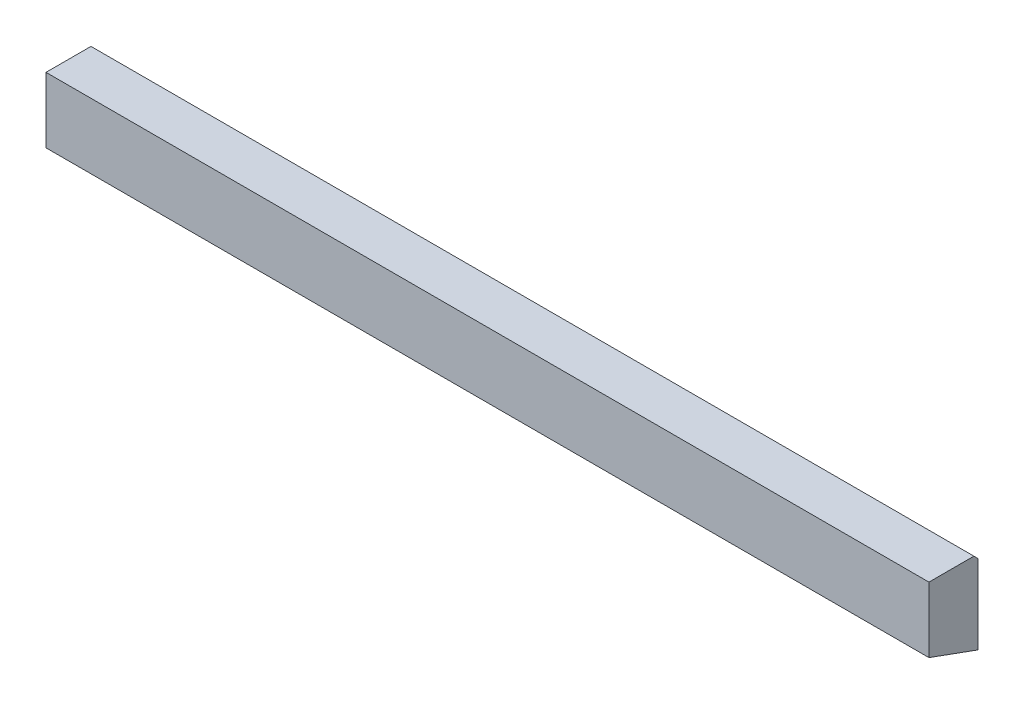
ISO-10303-21;
HEADER;
FILE_DESCRIPTION(('STEP AP214'),'2;1');
FILE_NAME('part.step','',(''),(''),'','','');
FILE_SCHEMA(('AUTOMOTIVE_DESIGN { 1 0 10303 214 1 1 1 1 }'));
ENDSEC;
DATA;
#1=APPLICATION_CONTEXT('core data for automotive mechanical design processes');
#2=APPLICATION_PROTOCOL_DEFINITION('international standard','automotive_design',2000,#1);
#3=PRODUCT_CONTEXT('',#1,'mechanical');
#4=PRODUCT('Part','Part','',(#3));
#5=PRODUCT_RELATED_PRODUCT_CATEGORY('part','',(#4));
#6=PRODUCT_DEFINITION_FORMATION('','',#4);
#7=PRODUCT_DEFINITION_CONTEXT('part definition',#1,'design');
#8=PRODUCT_DEFINITION('design','',#6,#7);
#9=PRODUCT_DEFINITION_SHAPE('','',#8);
#10=(LENGTH_UNIT() NAMED_UNIT(*) SI_UNIT(.MILLI.,.METRE.));
#11=(NAMED_UNIT(*) PLANE_ANGLE_UNIT() SI_UNIT($,.RADIAN.));
#12=(NAMED_UNIT(*) SI_UNIT($,.STERADIAN.) SOLID_ANGLE_UNIT());
#13=UNCERTAINTY_MEASURE_WITH_UNIT(LENGTH_MEASURE(1.E-05),#10,'distance_accuracy_value','');
#14=(GEOMETRIC_REPRESENTATION_CONTEXT(3) GLOBAL_UNCERTAINTY_ASSIGNED_CONTEXT((#13)) GLOBAL_UNIT_ASSIGNED_CONTEXT((#10,
#11,#12)) REPRESENTATION_CONTEXT('',''));
#15=CARTESIAN_POINT('',(0.,0.,0.));
#16=DIRECTION('',(0.,0.,1.));
#17=DIRECTION('',(1.,0.,0.));
#18=AXIS2_PLACEMENT_3D('',#15,#16,#17);
#19=CARTESIAN_POINT('',(108.,0.,0.));
#20=DIRECTION('',(0.,0.93969262078591,-0.342020143325666));
#21=DIRECTION('',(0.,0.342020143325666,0.93969262078591));
#22=AXIS2_PLACEMENT_3D('',#19,#20,#21);
#23=PLANE('',#22);
#24=DIRECTION('',(0.,-0.342020143325666,-0.93969262078591));
#25=VECTOR('',#24,1.);
#26=CARTESIAN_POINT('',(0.,0.,0.));
#27=LINE('',#26,#25);
#28=CARTESIAN_POINT('',(0.,0.,0.));
#29=VERTEX_POINT('',#28);
#30=CARTESIAN_POINT('',(0.,-2.18382140559719,-6.));
#31=VERTEX_POINT('',#30);
#32=EDGE_CURVE('E106',#29,#31,#27,.T.);
#33=ORIENTED_EDGE('',*,*,#32,.T.);
#34=DIRECTION('',(-1.,0.,0.));
#35=VECTOR('',#34,1.);
#36=CARTESIAN_POINT('',(108.,-2.18382140559719,-6.));
#37=LINE('',#36,#35);
#38=CARTESIAN_POINT('',(108.,-2.18382140559719,-6.));
#39=VERTEX_POINT('',#38);
#40=EDGE_CURVE('E87',#39,#31,#37,.T.);
#41=ORIENTED_EDGE('',*,*,#40,.F.);
#42=DIRECTION('',(0.,-0.342020143325666,-0.93969262078591));
#43=VECTOR('',#42,1.);
#44=CARTESIAN_POINT('',(108.,0.,0.));
#45=LINE('',#44,#43);
#46=CARTESIAN_POINT('',(108.,0.,0.));
#47=VERTEX_POINT('',#46);
#48=EDGE_CURVE('E93',#47,#39,#45,.T.);
#49=ORIENTED_EDGE('',*,*,#48,.F.);
#50=DIRECTION('',(-1.,0.,0.));
#51=VECTOR('',#50,1.);
#52=CARTESIAN_POINT('',(108.,0.,0.));
#53=LINE('',#52,#51);
#54=EDGE_CURVE('E116',#47,#29,#53,.T.);
#55=ORIENTED_EDGE('',*,*,#54,.T.);
#56=EDGE_LOOP('',(#33,#41,#49,#55));
#57=FACE_BOUND('',#56,.T.);
#58=ADVANCED_FACE('F39',(#57),#23,.F.);
#59=CARTESIAN_POINT('',(108.,-2.18382140559719,-6.));
#60=DIRECTION('',(0.,0.,1.));
#61=DIRECTION('',(0.,-1.,0.));
#62=AXIS2_PLACEMENT_3D('',#59,#60,#61);
#63=PLANE('',#62);
#64=DIRECTION('',(0.,1.,0.));
#65=VECTOR('',#64,1.);
#66=CARTESIAN_POINT('',(0.,-2.18382140559719,-6.));
#67=LINE('',#66,#65);
#68=CARTESIAN_POINT('',(0.,7.5,-6.));
#69=VERTEX_POINT('',#68);
#70=EDGE_CURVE('E129',#31,#69,#67,.T.);
#71=ORIENTED_EDGE('',*,*,#70,.T.);
#72=DIRECTION('',(1.,0.,0.));
#73=VECTOR('',#72,1.);
#74=CARTESIAN_POINT('',(108.,7.5,-6.));
#75=LINE('',#74,#73);
#76=CARTESIAN_POINT('',(108.,7.5,-6.));
#77=VERTEX_POINT('',#76);
#78=EDGE_CURVE('E48',#69,#77,#75,.T.);
#79=ORIENTED_EDGE('',*,*,#78,.T.);
#80=DIRECTION('',(0.,1.,0.));
#81=VECTOR('',#80,1.);
#82=CARTESIAN_POINT('',(108.,-2.18382140559719,-6.));
#83=LINE('',#82,#81);
#84=EDGE_CURVE('E83',#39,#77,#83,.T.);
#85=ORIENTED_EDGE('',*,*,#84,.F.);
#86=ORIENTED_EDGE('',*,*,#40,.T.);
#87=EDGE_LOOP('',(#71,#79,#85,#86));
#88=FACE_BOUND('',#87,.T.);
#89=ADVANCED_FACE('F85',(#88),#63,.F.);
#90=CARTESIAN_POINT('',(108.,8.,-6.));
#91=DIRECTION('',(0.,-1.,0.));
#92=DIRECTION('',(0.,0.,-1.));
#93=AXIS2_PLACEMENT_3D('',#90,#91,#92);
#94=PLANE('',#93);
#95=DIRECTION('',(0.,0.,1.));
#96=VECTOR('',#95,1.);
#97=CARTESIAN_POINT('',(108.,8.,-6.));
#98=LINE('',#97,#96);
#99=CARTESIAN_POINT('',(108.,8.,-5.50000000000001));
#100=VERTEX_POINT('',#99);
#101=CARTESIAN_POINT('',(108.,8.,0.));
#102=VERTEX_POINT('',#101);
#103=EDGE_CURVE('E92',#100,#102,#98,.T.);
#104=ORIENTED_EDGE('',*,*,#103,.F.);
#105=DIRECTION('',(-1.,0.,0.));
#106=VECTOR('',#105,1.);
#107=CARTESIAN_POINT('',(108.,8.,-5.50000000000001));
#108=LINE('',#107,#106);
#109=CARTESIAN_POINT('',(0.,8.,-5.50000000000001));
#110=VERTEX_POINT('',#109);
#111=EDGE_CURVE('E108',#100,#110,#108,.T.);
#112=ORIENTED_EDGE('',*,*,#111,.T.);
#113=DIRECTION('',(0.,0.,1.));
#114=VECTOR('',#113,1.);
#115=CARTESIAN_POINT('',(0.,8.,-6.));
#116=LINE('',#115,#114);
#117=CARTESIAN_POINT('',(0.,8.,0.));
#118=VERTEX_POINT('',#117);
#119=EDGE_CURVE('E126',#110,#118,#116,.T.);
#120=ORIENTED_EDGE('',*,*,#119,.T.);
#121=DIRECTION('',(-1.,0.,0.));
#122=VECTOR('',#121,1.);
#123=CARTESIAN_POINT('',(108.,8.,0.));
#124=LINE('',#123,#122);
#125=EDGE_CURVE('E109',#102,#118,#124,.T.);
#126=ORIENTED_EDGE('',*,*,#125,.F.);
#127=EDGE_LOOP('',(#104,#112,#120,#126));
#128=FACE_BOUND('',#127,.T.);
#129=ADVANCED_FACE('F141',(#128),#94,.F.);
#130=CARTESIAN_POINT('',(108.,8.,0.));
#131=DIRECTION('',(0.,0.,-1.));
#132=DIRECTION('',(0.,1.,0.));
#133=AXIS2_PLACEMENT_3D('',#130,#131,#132);
#134=PLANE('',#133);
#135=DIRECTION('',(0.,-1.,0.));
#136=VECTOR('',#135,1.);
#137=CARTESIAN_POINT('',(0.,8.,0.));
#138=LINE('',#137,#136);
#139=EDGE_CURVE('E103',#118,#29,#138,.T.);
#140=ORIENTED_EDGE('',*,*,#139,.T.);
#141=ORIENTED_EDGE('',*,*,#54,.F.);
#142=DIRECTION('',(0.,-1.,0.));
#143=VECTOR('',#142,1.);
#144=CARTESIAN_POINT('',(108.,8.,0.));
#145=LINE('',#144,#143);
#146=EDGE_CURVE('E98',#102,#47,#145,.T.);
#147=ORIENTED_EDGE('',*,*,#146,.F.);
#148=ORIENTED_EDGE('',*,*,#125,.T.);
#149=EDGE_LOOP('',(#140,#141,#147,#148));
#150=FACE_BOUND('',#149,.T.);
#151=ADVANCED_FACE('F144',(#150),#134,.F.);
#152=CARTESIAN_POINT('',(108.,0.,0.));
#153=DIRECTION('',(1.,0.,0.));
#154=DIRECTION('',(0.,0.,-1.));
#155=AXIS2_PLACEMENT_3D('',#152,#153,#154);
#156=PLANE('',#155);
#157=ORIENTED_EDGE('',*,*,#84,.T.);
#158=DIRECTION('',(0.,-0.707106781186557,-0.707106781186538));
#159=VECTOR('',#158,1.);
#160=CARTESIAN_POINT('',(108.,6.7499999999999,-6.75000000000009));
#161=LINE('',#160,#159);
#162=EDGE_CURVE('E11',#77,#100,#161,.F.);
#163=ORIENTED_EDGE('',*,*,#162,.T.);
#164=ORIENTED_EDGE('',*,*,#103,.T.);
#165=ORIENTED_EDGE('',*,*,#146,.T.);
#166=ORIENTED_EDGE('',*,*,#48,.T.);
#167=EDGE_LOOP('',(#157,#163,#164,#165,#166));
#168=FACE_BOUND('',#167,.T.);
#169=ADVANCED_FACE('F96',(#168),#156,.T.);
#170=CARTESIAN_POINT('',(0.,0.,0.));
#171=DIRECTION('',(1.,0.,0.));
#172=DIRECTION('',(0.,0.,-1.));
#173=AXIS2_PLACEMENT_3D('',#170,#171,#172);
#174=PLANE('',#173);
#175=ORIENTED_EDGE('',*,*,#119,.F.);
#176=DIRECTION('',(0.,0.707106781186557,0.707106781186538));
#177=VECTOR('',#176,1.);
#178=CARTESIAN_POINT('',(0.,8.,-5.50000000000001));
#179=LINE('',#178,#177);
#180=EDGE_CURVE('E62',#110,#69,#179,.F.);
#181=ORIENTED_EDGE('',*,*,#180,.T.);
#182=ORIENTED_EDGE('',*,*,#70,.F.);
#183=ORIENTED_EDGE('',*,*,#32,.F.);
#184=ORIENTED_EDGE('',*,*,#139,.F.);
#185=EDGE_LOOP('',(#175,#181,#182,#183,#184));
#186=FACE_BOUND('',#185,.T.);
#187=ADVANCED_FACE('F145',(#186),#174,.F.);
#188=CARTESIAN_POINT('',(108.,8.,-5.50000000000001));
#189=DIRECTION('',(0.,-0.707106781186538,0.707106781186557));
#190=DIRECTION('',(-1.,0.,0.));
#191=AXIS2_PLACEMENT_3D('',#188,#189,#190);
#192=PLANE('',#191);
#193=ORIENTED_EDGE('',*,*,#162,.F.);
#194=ORIENTED_EDGE('',*,*,#78,.F.);
#195=ORIENTED_EDGE('',*,*,#180,.F.);
#196=ORIENTED_EDGE('',*,*,#111,.F.);
#197=EDGE_LOOP('',(#193,#194,#195,#196));
#198=FACE_BOUND('',#197,.T.);
#199=ADVANCED_FACE('F41',(#198),#192,.F.);
#200=CLOSED_SHELL('',(#58,#89,#129,#151,#169,#187,#199));
#201=MANIFOLD_SOLID_BREP('B2',#200);
#202=ADVANCED_BREP_SHAPE_REPRESENTATION('',(#18,#201),#14);
#203=SHAPE_DEFINITION_REPRESENTATION(#9,#202);
ENDSEC;
END-ISO-10303-21;
